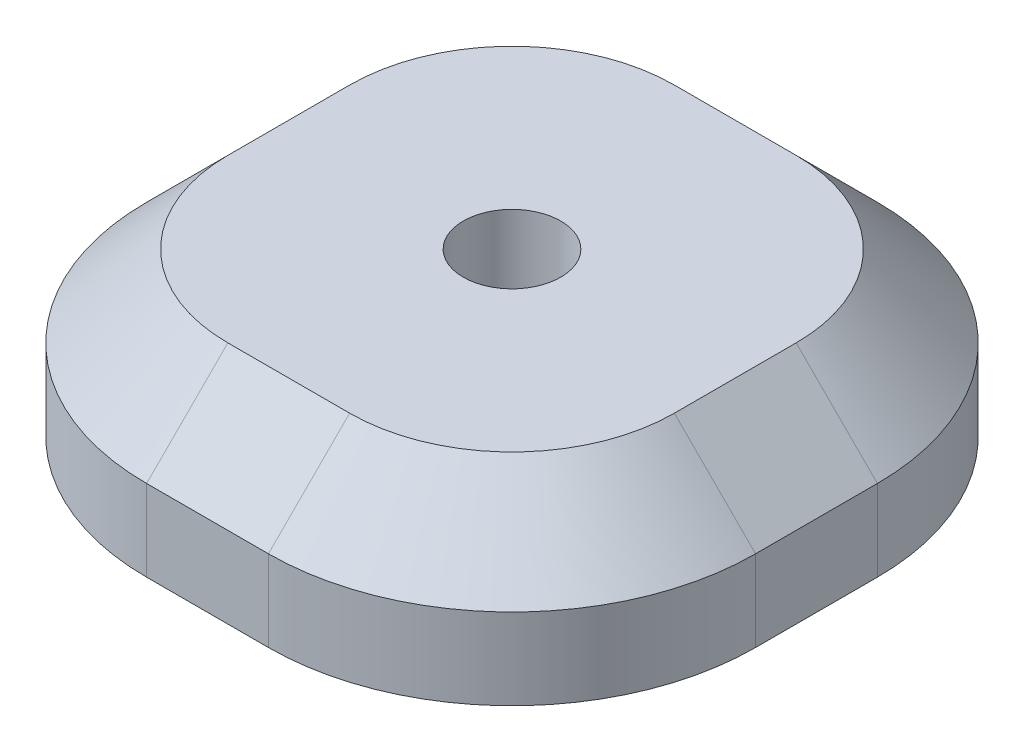
ISO-10303-21;
HEADER;
FILE_DESCRIPTION(('STEP AP214'),'2;1');
FILE_NAME('part.step','',(''),(''),'','','');
FILE_SCHEMA(('AUTOMOTIVE_DESIGN { 1 0 10303 214 1 1 1 1 }'));
ENDSEC;
DATA;
#1=APPLICATION_CONTEXT('core data for automotive mechanical design processes');
#2=APPLICATION_PROTOCOL_DEFINITION('international standard','automotive_design',2000,#1);
#3=PRODUCT_CONTEXT('',#1,'mechanical');
#4=PRODUCT('Part','Part','',(#3));
#5=PRODUCT_RELATED_PRODUCT_CATEGORY('part','',(#4));
#6=PRODUCT_DEFINITION_FORMATION('','',#4);
#7=PRODUCT_DEFINITION_CONTEXT('part definition',#1,'design');
#8=PRODUCT_DEFINITION('design','',#6,#7);
#9=PRODUCT_DEFINITION_SHAPE('','',#8);
#10=(LENGTH_UNIT() NAMED_UNIT(*) SI_UNIT(.MILLI.,.METRE.));
#11=(NAMED_UNIT(*) PLANE_ANGLE_UNIT() SI_UNIT($,.RADIAN.));
#12=(NAMED_UNIT(*) SI_UNIT($,.STERADIAN.) SOLID_ANGLE_UNIT());
#13=UNCERTAINTY_MEASURE_WITH_UNIT(LENGTH_MEASURE(1.E-05),#10,'distance_accuracy_value','');
#14=(GEOMETRIC_REPRESENTATION_CONTEXT(3) GLOBAL_UNCERTAINTY_ASSIGNED_CONTEXT((#13)) GLOBAL_UNIT_ASSIGNED_CONTEXT((#10,
#11,#12)) REPRESENTATION_CONTEXT('',''));
#15=CARTESIAN_POINT('',(0.,0.,0.));
#16=DIRECTION('',(0.,0.,1.));
#17=DIRECTION('',(1.,0.,0.));
#18=AXIS2_PLACEMENT_3D('',#15,#16,#17);
#19=CARTESIAN_POINT('',(-37.5,20.,37.5));
#20=DIRECTION('',(1.,0.,0.));
#21=DIRECTION('',(0.,0.,-1.));
#22=AXIS2_PLACEMENT_3D('',#19,#20,#21);
#23=PLANE('',#22);
#24=DIRECTION('',(0.,-1.,0.));
#25=VECTOR('',#24,1.);
#26=CARTESIAN_POINT('',(-37.5,20.,7.5));
#27=LINE('',#26,#25);
#28=CARTESIAN_POINT('',(-37.5,0.,7.5));
#29=VERTEX_POINT('',#28);
#30=CARTESIAN_POINT('',(-37.5,9.99999999999996,7.5));
#31=VERTEX_POINT('',#30);
#32=EDGE_CURVE('E212',#29,#31,#27,.F.);
#33=ORIENTED_EDGE('',*,*,#32,.T.);
#34=DIRECTION('',(0.,0.,-1.));
#35=VECTOR('',#34,1.);
#36=CARTESIAN_POINT('',(-37.5,9.99999999999996,37.5));
#37=LINE('',#36,#35);
#38=CARTESIAN_POINT('',(-37.5,9.99999999999996,-7.5));
#39=VERTEX_POINT('',#38);
#40=EDGE_CURVE('E239',#31,#39,#37,.T.);
#41=ORIENTED_EDGE('',*,*,#40,.T.);
#42=DIRECTION('',(0.,-1.,0.));
#43=VECTOR('',#42,1.);
#44=CARTESIAN_POINT('',(-37.5,20.,-7.5));
#45=LINE('',#44,#43);
#46=CARTESIAN_POINT('',(-37.5,0.,-7.5));
#47=VERTEX_POINT('',#46);
#48=EDGE_CURVE('E210',#39,#47,#45,.T.);
#49=ORIENTED_EDGE('',*,*,#48,.T.);
#50=DIRECTION('',(0.,0.,1.));
#51=VECTOR('',#50,1.);
#52=CARTESIAN_POINT('',(-37.5,0.,37.5));
#53=LINE('',#52,#51);
#54=EDGE_CURVE('E177',#47,#29,#53,.T.);
#55=ORIENTED_EDGE('',*,*,#54,.T.);
#56=EDGE_LOOP('',(#33,#41,#49,#55));
#57=FACE_BOUND('',#56,.T.);
#58=ADVANCED_FACE('F33',(#57),#23,.F.);
#59=CARTESIAN_POINT('',(37.5,20.,37.5));
#60=DIRECTION('',(0.,0.,-1.));
#61=DIRECTION('',(-1.,0.,0.));
#62=AXIS2_PLACEMENT_3D('',#59,#60,#61);
#63=PLANE('',#62);
#64=DIRECTION('',(0.,-1.,0.));
#65=VECTOR('',#64,1.);
#66=CARTESIAN_POINT('',(7.5,20.,37.5));
#67=LINE('',#66,#65);
#68=CARTESIAN_POINT('',(7.5,0.,37.5));
#69=VERTEX_POINT('',#68);
#70=CARTESIAN_POINT('',(7.5,9.99999999999996,37.5));
#71=VERTEX_POINT('',#70);
#72=EDGE_CURVE('E205',#69,#71,#67,.F.);
#73=ORIENTED_EDGE('',*,*,#72,.T.);
#74=DIRECTION('',(-1.,0.,0.));
#75=VECTOR('',#74,1.);
#76=CARTESIAN_POINT('',(37.5,9.99999999999996,37.5));
#77=LINE('',#76,#75);
#78=CARTESIAN_POINT('',(-7.5,9.99999999999996,37.5));
#79=VERTEX_POINT('',#78);
#80=EDGE_CURVE('E235',#71,#79,#77,.T.);
#81=ORIENTED_EDGE('',*,*,#80,.T.);
#82=DIRECTION('',(0.,-1.,0.));
#83=VECTOR('',#82,1.);
#84=CARTESIAN_POINT('',(-7.5,20.,37.5));
#85=LINE('',#84,#83);
#86=CARTESIAN_POINT('',(-7.5,0.,37.5));
#87=VERTEX_POINT('',#86);
#88=EDGE_CURVE('E208',#79,#87,#85,.T.);
#89=ORIENTED_EDGE('',*,*,#88,.T.);
#90=DIRECTION('',(1.,0.,0.));
#91=VECTOR('',#90,1.);
#92=CARTESIAN_POINT('',(37.5,0.,37.5));
#93=LINE('',#92,#91);
#94=EDGE_CURVE('E180',#87,#69,#93,.T.);
#95=ORIENTED_EDGE('',*,*,#94,.T.);
#96=EDGE_LOOP('',(#73,#81,#89,#95));
#97=FACE_BOUND('',#96,.T.);
#98=ADVANCED_FACE('F340',(#97),#63,.F.);
#99=CARTESIAN_POINT('',(37.5,20.,-37.5));
#100=DIRECTION('',(-1.,0.,0.));
#101=DIRECTION('',(0.,0.,1.));
#102=AXIS2_PLACEMENT_3D('',#99,#100,#101);
#103=PLANE('',#102);
#104=DIRECTION('',(0.,-1.,0.));
#105=VECTOR('',#104,1.);
#106=CARTESIAN_POINT('',(37.5,20.,-7.5));
#107=LINE('',#106,#105);
#108=CARTESIAN_POINT('',(37.5,0.,-7.5));
#109=VERTEX_POINT('',#108);
#110=CARTESIAN_POINT('',(37.5,9.99999999999996,-7.5));
#111=VERTEX_POINT('',#110);
#112=EDGE_CURVE('E203',#109,#111,#107,.F.);
#113=ORIENTED_EDGE('',*,*,#112,.T.);
#114=DIRECTION('',(0.,0.,1.));
#115=VECTOR('',#114,1.);
#116=CARTESIAN_POINT('',(37.5,9.99999999999996,-37.5));
#117=LINE('',#116,#115);
#118=CARTESIAN_POINT('',(37.5,9.99999999999996,7.5));
#119=VERTEX_POINT('',#118);
#120=EDGE_CURVE('E11',#111,#119,#117,.T.);
#121=ORIENTED_EDGE('',*,*,#120,.T.);
#122=DIRECTION('',(0.,-1.,0.));
#123=VECTOR('',#122,1.);
#124=CARTESIAN_POINT('',(37.5,20.,7.5));
#125=LINE('',#124,#123);
#126=CARTESIAN_POINT('',(37.5,0.,7.5));
#127=VERTEX_POINT('',#126);
#128=EDGE_CURVE('E201',#119,#127,#125,.T.);
#129=ORIENTED_EDGE('',*,*,#128,.T.);
#130=DIRECTION('',(0.,0.,-1.));
#131=VECTOR('',#130,1.);
#132=CARTESIAN_POINT('',(37.5,0.,-37.5));
#133=LINE('',#132,#131);
#134=EDGE_CURVE('E183',#127,#109,#133,.T.);
#135=ORIENTED_EDGE('',*,*,#134,.T.);
#136=EDGE_LOOP('',(#113,#121,#129,#135));
#137=FACE_BOUND('',#136,.T.);
#138=ADVANCED_FACE('F319',(#137),#103,.F.);
#139=CARTESIAN_POINT('',(-37.5,20.,-37.5));
#140=DIRECTION('',(0.,0.,1.));
#141=DIRECTION('',(1.,0.,0.));
#142=AXIS2_PLACEMENT_3D('',#139,#140,#141);
#143=PLANE('',#142);
#144=DIRECTION('',(0.,-1.,0.));
#145=VECTOR('',#144,1.);
#146=CARTESIAN_POINT('',(-7.5,20.,-37.5));
#147=LINE('',#146,#145);
#148=CARTESIAN_POINT('',(-7.5,0.,-37.5));
#149=VERTEX_POINT('',#148);
#150=CARTESIAN_POINT('',(-7.5,9.99999999999996,-37.5));
#151=VERTEX_POINT('',#150);
#152=EDGE_CURVE('E189',#149,#151,#147,.F.);
#153=ORIENTED_EDGE('',*,*,#152,.T.);
#154=DIRECTION('',(1.,0.,0.));
#155=VECTOR('',#154,1.);
#156=CARTESIAN_POINT('',(-37.5,9.99999999999996,-37.5));
#157=LINE('',#156,#155);
#158=CARTESIAN_POINT('',(7.5,9.99999999999996,-37.5));
#159=VERTEX_POINT('',#158);
#160=EDGE_CURVE('E57',#151,#159,#157,.T.);
#161=ORIENTED_EDGE('',*,*,#160,.T.);
#162=DIRECTION('',(0.,-1.,0.));
#163=VECTOR('',#162,1.);
#164=CARTESIAN_POINT('',(7.5,20.,-37.5));
#165=LINE('',#164,#163);
#166=CARTESIAN_POINT('',(7.5,0.,-37.5));
#167=VERTEX_POINT('',#166);
#168=EDGE_CURVE('E191',#159,#167,#165,.T.);
#169=ORIENTED_EDGE('',*,*,#168,.T.);
#170=DIRECTION('',(-1.,0.,0.));
#171=VECTOR('',#170,1.);
#172=CARTESIAN_POINT('',(-37.5,0.,-37.5));
#173=LINE('',#172,#171);
#174=EDGE_CURVE('E186',#167,#149,#173,.T.);
#175=ORIENTED_EDGE('',*,*,#174,.T.);
#176=EDGE_LOOP('',(#153,#161,#169,#175));
#177=FACE_BOUND('',#176,.T.);
#178=ADVANCED_FACE('F279',(#177),#143,.F.);
#179=CARTESIAN_POINT('',(0.,20.,0.));
#180=DIRECTION('',(0.,-1.,0.));
#181=DIRECTION('',(0.,0.,-1.));
#182=AXIS2_PLACEMENT_3D('',#179,#180,#181);
#183=PLANE('',#182);
#184=CARTESIAN_POINT('',(0.,20.,0.));
#185=DIRECTION('',(0.,1.,0.));
#186=DIRECTION('',(0.,0.,1.));
#187=AXIS2_PLACEMENT_3D('',#184,#185,#186);
#188=CIRCLE('',#187,6.);
#189=CARTESIAN_POINT('',(0.,20.,6.));
#190=VERTEX_POINT('',#189);
#191=EDGE_CURVE('E148',#190,#190,#188,.T.);
#192=ORIENTED_EDGE('',*,*,#191,.F.);
#193=EDGE_LOOP('',(#192));
#194=FACE_BOUND('',#193,.T.);
#195=DIRECTION('',(1.,0.,0.));
#196=VECTOR('',#195,1.);
#197=CARTESIAN_POINT('',(0.,20.,27.5));
#198=LINE('',#197,#196);
#199=CARTESIAN_POINT('',(-7.5,20.,27.5));
#200=VERTEX_POINT('',#199);
#201=CARTESIAN_POINT('',(7.5,20.,27.5));
#202=VERTEX_POINT('',#201);
#203=EDGE_CURVE('E227',#200,#202,#198,.T.);
#204=ORIENTED_EDGE('',*,*,#203,.T.);
#205=CARTESIAN_POINT('',(7.5,20.,7.5));
#206=DIRECTION('',(0.,-1.,0.));
#207=DIRECTION('',(0.,0.,-1.));
#208=AXIS2_PLACEMENT_3D('',#205,#206,#207);
#209=CIRCLE('',#208,20.);
#210=CARTESIAN_POINT('',(27.5,20.,7.5));
#211=VERTEX_POINT('',#210);
#212=EDGE_CURVE('E229',#202,#211,#209,.F.);
#213=ORIENTED_EDGE('',*,*,#212,.T.);
#214=DIRECTION('',(0.,0.,-1.));
#215=VECTOR('',#214,1.);
#216=CARTESIAN_POINT('',(27.5,20.,0.));
#217=LINE('',#216,#215);
#218=CARTESIAN_POINT('',(27.5,20.,-7.5));
#219=VERTEX_POINT('',#218);
#220=EDGE_CURVE('E215',#211,#219,#217,.T.);
#221=ORIENTED_EDGE('',*,*,#220,.T.);
#222=CARTESIAN_POINT('',(7.5,20.,-7.5));
#223=DIRECTION('',(0.,-1.,0.));
#224=DIRECTION('',(0.,0.,-1.));
#225=AXIS2_PLACEMENT_3D('',#222,#223,#224);
#226=CIRCLE('',#225,20.);
#227=CARTESIAN_POINT('',(7.5,20.,-27.5));
#228=VERTEX_POINT('',#227);
#229=EDGE_CURVE('E217',#219,#228,#226,.F.);
#230=ORIENTED_EDGE('',*,*,#229,.T.);
#231=DIRECTION('',(-1.,0.,0.));
#232=VECTOR('',#231,1.);
#233=CARTESIAN_POINT('',(0.,20.,-27.5));
#234=LINE('',#233,#232);
#235=CARTESIAN_POINT('',(-7.5,20.,-27.5));
#236=VERTEX_POINT('',#235);
#237=EDGE_CURVE('E219',#228,#236,#234,.T.);
#238=ORIENTED_EDGE('',*,*,#237,.T.);
#239=CARTESIAN_POINT('',(-7.5,20.,-7.5));
#240=DIRECTION('',(0.,-1.,0.));
#241=DIRECTION('',(0.,0.,-1.));
#242=AXIS2_PLACEMENT_3D('',#239,#240,#241);
#243=CIRCLE('',#242,20.);
#244=CARTESIAN_POINT('',(-27.5,20.,-7.5));
#245=VERTEX_POINT('',#244);
#246=EDGE_CURVE('E221',#236,#245,#243,.F.);
#247=ORIENTED_EDGE('',*,*,#246,.T.);
#248=DIRECTION('',(0.,0.,1.));
#249=VECTOR('',#248,1.);
#250=CARTESIAN_POINT('',(-27.5,20.,0.));
#251=LINE('',#250,#249);
#252=CARTESIAN_POINT('',(-27.5,20.,7.5));
#253=VERTEX_POINT('',#252);
#254=EDGE_CURVE('E223',#245,#253,#251,.T.);
#255=ORIENTED_EDGE('',*,*,#254,.T.);
#256=CARTESIAN_POINT('',(-7.5,20.,7.5));
#257=DIRECTION('',(0.,-1.,0.));
#258=DIRECTION('',(0.,0.,-1.));
#259=AXIS2_PLACEMENT_3D('',#256,#257,#258);
#260=CIRCLE('',#259,20.);
#261=EDGE_CURVE('E225',#253,#200,#260,.F.);
#262=ORIENTED_EDGE('',*,*,#261,.T.);
#263=EDGE_LOOP('',(#204,#213,#221,#230,#238,#247,#255,#262));
#264=FACE_BOUND('',#263,.T.);
#265=ADVANCED_FACE('F305',(#194,#264),#183,.F.);
#266=CARTESIAN_POINT('',(0.,0.,0.));
#267=DIRECTION('',(0.,-1.,0.));
#268=DIRECTION('',(0.,0.,-1.));
#269=AXIS2_PLACEMENT_3D('',#266,#267,#268);
#270=PLANE('',#269);
#271=CARTESIAN_POINT('',(-12.5,0.,12.5));
#272=DIRECTION('',(0.,-1.,0.));
#273=DIRECTION('',(0.,0.,-1.));
#274=AXIS2_PLACEMENT_3D('',#271,#272,#273);
#275=CIRCLE('',#274,6.);
#276=CARTESIAN_POINT('',(-12.5,0.,6.5));
#277=VERTEX_POINT('',#276);
#278=EDGE_CURVE('E147',#277,#277,#275,.T.);
#279=ORIENTED_EDGE('',*,*,#278,.F.);
#280=EDGE_LOOP('',(#279));
#281=FACE_BOUND('',#280,.T.);
#282=CARTESIAN_POINT('',(12.5,0.,12.5));
#283=DIRECTION('',(0.,-1.,0.));
#284=DIRECTION('',(0.,0.,-1.));
#285=AXIS2_PLACEMENT_3D('',#282,#283,#284);
#286=CIRCLE('',#285,6.);
#287=CARTESIAN_POINT('',(12.5,0.,6.5));
#288=VERTEX_POINT('',#287);
#289=EDGE_CURVE('E158',#288,#288,#286,.T.);
#290=ORIENTED_EDGE('',*,*,#289,.F.);
#291=EDGE_LOOP('',(#290));
#292=FACE_BOUND('',#291,.T.);
#293=CARTESIAN_POINT('',(12.5,0.,-12.5));
#294=DIRECTION('',(0.,-1.,0.));
#295=DIRECTION('',(0.,0.,-1.));
#296=AXIS2_PLACEMENT_3D('',#293,#294,#295);
#297=CIRCLE('',#296,6.);
#298=CARTESIAN_POINT('',(12.5,0.,-18.5));
#299=VERTEX_POINT('',#298);
#300=EDGE_CURVE('E164',#299,#299,#297,.T.);
#301=ORIENTED_EDGE('',*,*,#300,.F.);
#302=EDGE_LOOP('',(#301));
#303=FACE_BOUND('',#302,.T.);
#304=CARTESIAN_POINT('',(-12.5,0.,-12.5));
#305=DIRECTION('',(0.,-1.,0.));
#306=DIRECTION('',(0.,0.,-1.));
#307=AXIS2_PLACEMENT_3D('',#304,#305,#306);
#308=CIRCLE('',#307,6.);
#309=CARTESIAN_POINT('',(-12.5,0.,-18.5));
#310=VERTEX_POINT('',#309);
#311=EDGE_CURVE('E170',#310,#310,#308,.T.);
#312=ORIENTED_EDGE('',*,*,#311,.F.);
#313=EDGE_LOOP('',(#312));
#314=FACE_BOUND('',#313,.T.);
#315=ORIENTED_EDGE('',*,*,#174,.F.);
#316=CARTESIAN_POINT('',(7.5,0.,-7.5));
#317=DIRECTION('',(0.,-1.,0.));
#318=DIRECTION('',(0.,0.,-1.));
#319=AXIS2_PLACEMENT_3D('',#316,#317,#318);
#320=CIRCLE('',#319,30.);
#321=EDGE_CURVE('E199',#167,#109,#320,.T.);
#322=ORIENTED_EDGE('',*,*,#321,.T.);
#323=ORIENTED_EDGE('',*,*,#134,.F.);
#324=CARTESIAN_POINT('',(7.5,0.,7.5));
#325=DIRECTION('',(0.,-1.,0.));
#326=DIRECTION('',(0.,0.,-1.));
#327=AXIS2_PLACEMENT_3D('',#324,#325,#326);
#328=CIRCLE('',#327,30.);
#329=EDGE_CURVE('E193',#127,#69,#328,.T.);
#330=ORIENTED_EDGE('',*,*,#329,.T.);
#331=ORIENTED_EDGE('',*,*,#94,.F.);
#332=CARTESIAN_POINT('',(-7.5,0.,7.5));
#333=DIRECTION('',(0.,-1.,0.));
#334=DIRECTION('',(0.,0.,-1.));
#335=AXIS2_PLACEMENT_3D('',#332,#333,#334);
#336=CIRCLE('',#335,30.);
#337=EDGE_CURVE('E197',#87,#29,#336,.T.);
#338=ORIENTED_EDGE('',*,*,#337,.T.);
#339=ORIENTED_EDGE('',*,*,#54,.F.);
#340=CARTESIAN_POINT('',(-7.5,0.,-7.5));
#341=DIRECTION('',(0.,-1.,0.));
#342=DIRECTION('',(0.,0.,-1.));
#343=AXIS2_PLACEMENT_3D('',#340,#341,#342);
#344=CIRCLE('',#343,30.);
#345=EDGE_CURVE('E195',#47,#149,#344,.T.);
#346=ORIENTED_EDGE('',*,*,#345,.T.);
#347=EDGE_LOOP('',(#315,#322,#323,#330,#331,#338,#339,#346));
#348=FACE_BOUND('',#347,.T.);
#349=ADVANCED_FACE('F283',(#281,#292,#303,#314,#348),#270,.T.);
#350=CARTESIAN_POINT('',(7.5,20.,-7.5));
#351=DIRECTION('',(0.,-1.,0.));
#352=DIRECTION('',(0.,0.,-1.));
#353=AXIS2_PLACEMENT_3D('',#350,#351,#352);
#354=CYLINDRICAL_SURFACE('',#353,30.);
#355=ORIENTED_EDGE('',*,*,#168,.F.);
#356=CARTESIAN_POINT('',(7.5,9.99999999999996,-7.5));
#357=DIRECTION('',(0.,-1.,0.));
#358=DIRECTION('',(0.,0.,-1.));
#359=AXIS2_PLACEMENT_3D('',#356,#357,#358);
#360=CIRCLE('',#359,30.);
#361=EDGE_CURVE('E42',#159,#111,#360,.T.);
#362=ORIENTED_EDGE('',*,*,#361,.T.);
#363=ORIENTED_EDGE('',*,*,#112,.F.);
#364=ORIENTED_EDGE('',*,*,#321,.F.);
#365=EDGE_LOOP('',(#355,#362,#363,#364));
#366=FACE_BOUND('',#365,.T.);
#367=ADVANCED_FACE('F349',(#366),#354,.T.);
#368=CARTESIAN_POINT('',(-7.5,20.,7.5));
#369=DIRECTION('',(0.,-1.,0.));
#370=DIRECTION('',(0.,0.,-1.));
#371=AXIS2_PLACEMENT_3D('',#368,#369,#370);
#372=CYLINDRICAL_SURFACE('',#371,30.);
#373=ORIENTED_EDGE('',*,*,#88,.F.);
#374=CARTESIAN_POINT('',(-7.5,9.99999999999996,7.5));
#375=DIRECTION('',(0.,-1.,0.));
#376=DIRECTION('',(0.,0.,-1.));
#377=AXIS2_PLACEMENT_3D('',#374,#375,#376);
#378=CIRCLE('',#377,30.);
#379=EDGE_CURVE('E237',#79,#31,#378,.T.);
#380=ORIENTED_EDGE('',*,*,#379,.T.);
#381=ORIENTED_EDGE('',*,*,#32,.F.);
#382=ORIENTED_EDGE('',*,*,#337,.F.);
#383=EDGE_LOOP('',(#373,#380,#381,#382));
#384=FACE_BOUND('',#383,.T.);
#385=ADVANCED_FACE('F292',(#384),#372,.T.);
#386=CARTESIAN_POINT('',(-7.5,20.,-7.5));
#387=DIRECTION('',(0.,-1.,0.));
#388=DIRECTION('',(0.,0.,-1.));
#389=AXIS2_PLACEMENT_3D('',#386,#387,#388);
#390=CYLINDRICAL_SURFACE('',#389,30.);
#391=ORIENTED_EDGE('',*,*,#48,.F.);
#392=CARTESIAN_POINT('',(-7.5,9.99999999999996,-7.5));
#393=DIRECTION('',(0.,-1.,0.));
#394=DIRECTION('',(0.,0.,-1.));
#395=AXIS2_PLACEMENT_3D('',#392,#393,#394);
#396=CIRCLE('',#395,30.);
#397=EDGE_CURVE('E241',#39,#151,#396,.T.);
#398=ORIENTED_EDGE('',*,*,#397,.T.);
#399=ORIENTED_EDGE('',*,*,#152,.F.);
#400=ORIENTED_EDGE('',*,*,#345,.F.);
#401=EDGE_LOOP('',(#391,#398,#399,#400));
#402=FACE_BOUND('',#401,.T.);
#403=ADVANCED_FACE('F277',(#402),#390,.T.);
#404=CARTESIAN_POINT('',(7.5,20.,7.5));
#405=DIRECTION('',(0.,-1.,0.));
#406=DIRECTION('',(0.,0.,-1.));
#407=AXIS2_PLACEMENT_3D('',#404,#405,#406);
#408=CYLINDRICAL_SURFACE('',#407,30.);
#409=ORIENTED_EDGE('',*,*,#128,.F.);
#410=CARTESIAN_POINT('',(7.5,9.99999999999996,7.5));
#411=DIRECTION('',(0.,-1.,0.));
#412=DIRECTION('',(0.,0.,-1.));
#413=AXIS2_PLACEMENT_3D('',#410,#411,#412);
#414=CIRCLE('',#413,30.);
#415=EDGE_CURVE('E232',#119,#71,#414,.T.);
#416=ORIENTED_EDGE('',*,*,#415,.T.);
#417=ORIENTED_EDGE('',*,*,#72,.F.);
#418=ORIENTED_EDGE('',*,*,#329,.F.);
#419=EDGE_LOOP('',(#409,#416,#417,#418));
#420=FACE_BOUND('',#419,.T.);
#421=ADVANCED_FACE('F323',(#420),#408,.T.);
#422=CARTESIAN_POINT('',(-7.5,20.,-7.5));
#423=DIRECTION('',(0.,-1.,0.));
#424=DIRECTION('',(0.,0.,-1.));
#425=AXIS2_PLACEMENT_3D('',#422,#423,#424);
#426=CONICAL_SURFACE('',#425,20.,0.785398163397448);
#427=DIRECTION('',(0.,0.707106781186547,0.707106781186547));
#428=VECTOR('',#427,1.);
#429=CARTESIAN_POINT('',(-7.5,9.99999999999996,-37.5));
#430=LINE('',#429,#428);
#431=EDGE_CURVE('E259',#151,#236,#430,.T.);
#432=ORIENTED_EDGE('',*,*,#431,.F.);
#433=ORIENTED_EDGE('',*,*,#397,.F.);
#434=DIRECTION('',(-0.707106781186547,-0.707106781186547,0.));
#435=VECTOR('',#434,1.);
#436=CARTESIAN_POINT('',(-27.5,20.,-7.5));
#437=LINE('',#436,#435);
#438=EDGE_CURVE('E37',#245,#39,#437,.T.);
#439=ORIENTED_EDGE('',*,*,#438,.F.);
#440=ORIENTED_EDGE('',*,*,#246,.F.);
#441=EDGE_LOOP('',(#432,#433,#439,#440));
#442=FACE_BOUND('',#441,.T.);
#443=ADVANCED_FACE('F35',(#442),#426,.T.);
#444=CARTESIAN_POINT('',(-27.5,20.,0.));
#445=DIRECTION('',(0.707106781186547,-0.707106781186547,0.));
#446=DIRECTION('',(0.,0.,1.));
#447=AXIS2_PLACEMENT_3D('',#444,#445,#446);
#448=PLANE('',#447);
#449=ORIENTED_EDGE('',*,*,#438,.T.);
#450=ORIENTED_EDGE('',*,*,#40,.F.);
#451=DIRECTION('',(-0.707106781186547,-0.707106781186547,0.));
#452=VECTOR('',#451,1.);
#453=CARTESIAN_POINT('',(-27.5,20.,7.5));
#454=LINE('',#453,#452);
#455=EDGE_CURVE('E257',#253,#31,#454,.T.);
#456=ORIENTED_EDGE('',*,*,#455,.F.);
#457=ORIENTED_EDGE('',*,*,#254,.F.);
#458=EDGE_LOOP('',(#449,#450,#456,#457));
#459=FACE_BOUND('',#458,.T.);
#460=ADVANCED_FACE('F269',(#459),#448,.F.);
#461=CARTESIAN_POINT('',(0.,20.,-27.5));
#462=DIRECTION('',(0.,-0.707106781186547,0.707106781186547));
#463=DIRECTION('',(-1.,0.,0.));
#464=AXIS2_PLACEMENT_3D('',#461,#462,#463);
#465=PLANE('',#464);
#466=ORIENTED_EDGE('',*,*,#431,.T.);
#467=ORIENTED_EDGE('',*,*,#237,.F.);
#468=DIRECTION('',(0.,0.707106781186547,0.707106781186547));
#469=VECTOR('',#468,1.);
#470=CARTESIAN_POINT('',(7.5,9.99999999999996,-37.5));
#471=LINE('',#470,#469);
#472=EDGE_CURVE('E254',#159,#228,#471,.T.);
#473=ORIENTED_EDGE('',*,*,#472,.F.);
#474=ORIENTED_EDGE('',*,*,#160,.F.);
#475=EDGE_LOOP('',(#466,#467,#473,#474));
#476=FACE_BOUND('',#475,.T.);
#477=ADVANCED_FACE('F308',(#476),#465,.F.);
#478=CARTESIAN_POINT('',(-7.5,20.,7.5));
#479=DIRECTION('',(0.,-1.,0.));
#480=DIRECTION('',(0.,0.,-1.));
#481=AXIS2_PLACEMENT_3D('',#478,#479,#480);
#482=CONICAL_SURFACE('',#481,20.,0.785398163397448);
#483=ORIENTED_EDGE('',*,*,#455,.T.);
#484=ORIENTED_EDGE('',*,*,#379,.F.);
#485=DIRECTION('',(0.,-0.707106781186547,0.707106781186547));
#486=VECTOR('',#485,1.);
#487=CARTESIAN_POINT('',(-7.5,20.,27.5));
#488=LINE('',#487,#486);
#489=EDGE_CURVE('E251',#200,#79,#488,.T.);
#490=ORIENTED_EDGE('',*,*,#489,.F.);
#491=ORIENTED_EDGE('',*,*,#261,.F.);
#492=EDGE_LOOP('',(#483,#484,#490,#491));
#493=FACE_BOUND('',#492,.T.);
#494=ADVANCED_FACE('F296',(#493),#482,.T.);
#495=CARTESIAN_POINT('',(7.5,20.,-7.5));
#496=DIRECTION('',(0.,-1.,0.));
#497=DIRECTION('',(0.,0.,-1.));
#498=AXIS2_PLACEMENT_3D('',#495,#496,#497);
#499=CONICAL_SURFACE('',#498,20.,0.785398163397448);
#500=ORIENTED_EDGE('',*,*,#472,.T.);
#501=ORIENTED_EDGE('',*,*,#229,.F.);
#502=DIRECTION('',(-0.707106781186547,0.707106781186547,0.));
#503=VECTOR('',#502,1.);
#504=CARTESIAN_POINT('',(37.5,9.99999999999996,-7.5));
#505=LINE('',#504,#503);
#506=EDGE_CURVE('E248',#111,#219,#505,.T.);
#507=ORIENTED_EDGE('',*,*,#506,.F.);
#508=ORIENTED_EDGE('',*,*,#361,.F.);
#509=EDGE_LOOP('',(#500,#501,#507,#508));
#510=FACE_BOUND('',#509,.T.);
#511=ADVANCED_FACE('F310',(#510),#499,.T.);
#512=CARTESIAN_POINT('',(0.,20.,27.5));
#513=DIRECTION('',(0.,-0.707106781186547,-0.707106781186547));
#514=DIRECTION('',(1.,0.,0.));
#515=AXIS2_PLACEMENT_3D('',#512,#513,#514);
#516=PLANE('',#515);
#517=ORIENTED_EDGE('',*,*,#489,.T.);
#518=ORIENTED_EDGE('',*,*,#80,.F.);
#519=DIRECTION('',(0.,-0.707106781186547,0.707106781186547));
#520=VECTOR('',#519,1.);
#521=CARTESIAN_POINT('',(7.5,20.,27.5));
#522=LINE('',#521,#520);
#523=EDGE_CURVE('E246',#202,#71,#522,.T.);
#524=ORIENTED_EDGE('',*,*,#523,.F.);
#525=ORIENTED_EDGE('',*,*,#203,.F.);
#526=EDGE_LOOP('',(#517,#518,#524,#525));
#527=FACE_BOUND('',#526,.T.);
#528=ADVANCED_FACE('F301',(#527),#516,.F.);
#529=CARTESIAN_POINT('',(27.5,20.,0.));
#530=DIRECTION('',(-0.707106781186547,-0.707106781186547,0.));
#531=DIRECTION('',(0.,0.,-1.));
#532=AXIS2_PLACEMENT_3D('',#529,#530,#531);
#533=PLANE('',#532);
#534=ORIENTED_EDGE('',*,*,#506,.T.);
#535=ORIENTED_EDGE('',*,*,#220,.F.);
#536=DIRECTION('',(-0.707106781186547,0.707106781186547,0.));
#537=VECTOR('',#536,1.);
#538=CARTESIAN_POINT('',(37.5,9.99999999999996,7.5));
#539=LINE('',#538,#537);
#540=EDGE_CURVE('E176',#119,#211,#539,.T.);
#541=ORIENTED_EDGE('',*,*,#540,.F.);
#542=ORIENTED_EDGE('',*,*,#120,.F.);
#543=EDGE_LOOP('',(#534,#535,#541,#542));
#544=FACE_BOUND('',#543,.T.);
#545=ADVANCED_FACE('F316',(#544),#533,.F.);
#546=CARTESIAN_POINT('',(7.5,20.,7.5));
#547=DIRECTION('',(0.,-1.,0.));
#548=DIRECTION('',(0.,0.,-1.));
#549=AXIS2_PLACEMENT_3D('',#546,#547,#548);
#550=CONICAL_SURFACE('',#549,20.,0.785398163397448);
#551=ORIENTED_EDGE('',*,*,#523,.T.);
#552=ORIENTED_EDGE('',*,*,#415,.F.);
#553=ORIENTED_EDGE('',*,*,#540,.T.);
#554=ORIENTED_EDGE('',*,*,#212,.F.);
#555=EDGE_LOOP('',(#551,#552,#553,#554));
#556=FACE_BOUND('',#555,.T.);
#557=ADVANCED_FACE('F326',(#556),#550,.T.);
#558=CARTESIAN_POINT('',(-12.5,9.99999999999999,-12.5));
#559=DIRECTION('',(0.,-1.,0.));
#560=DIRECTION('',(0.,0.,-1.));
#561=AXIS2_PLACEMENT_3D('',#558,#559,#560);
#562=CONICAL_SURFACE('',#561,6.,1.02974425867665);
#563=CARTESIAN_POINT('',(-12.5,13.6051637141654,-12.5));
#564=VERTEX_POINT('',#563);
#565=VERTEX_LOOP('',#564);
#566=FACE_BOUND('',#565,.T.);
#567=CARTESIAN_POINT('',(-12.5,9.99999999999999,-12.5));
#568=DIRECTION('',(0.,-1.,0.));
#569=DIRECTION('',(0.,0.,-1.));
#570=AXIS2_PLACEMENT_3D('',#567,#568,#569);
#571=CIRCLE('',#570,6.);
#572=CARTESIAN_POINT('',(-12.5,9.99999999999999,-18.5));
#573=VERTEX_POINT('',#572);
#574=EDGE_CURVE('E173',#573,#573,#571,.T.);
#575=ORIENTED_EDGE('',*,*,#574,.T.);
#576=EDGE_LOOP('',(#575));
#577=FACE_BOUND('',#576,.T.);
#578=ADVANCED_FACE('F328',(#566,#577),#562,.F.);
#579=CARTESIAN_POINT('',(-12.5,0.,-12.5));
#580=DIRECTION('',(0.,-1.,0.));
#581=DIRECTION('',(0.,0.,-1.));
#582=AXIS2_PLACEMENT_3D('',#579,#580,#581);
#583=CYLINDRICAL_SURFACE('',#582,6.);
#584=ORIENTED_EDGE('',*,*,#574,.F.);
#585=EDGE_LOOP('',(#584));
#586=FACE_BOUND('',#585,.T.);
#587=ORIENTED_EDGE('',*,*,#311,.T.);
#588=EDGE_LOOP('',(#587));
#589=FACE_BOUND('',#588,.T.);
#590=ADVANCED_FACE('F334',(#586,#589),#583,.F.);
#591=CARTESIAN_POINT('',(12.5,9.99999999999999,-12.5));
#592=DIRECTION('',(0.,-1.,0.));
#593=DIRECTION('',(0.,0.,-1.));
#594=AXIS2_PLACEMENT_3D('',#591,#592,#593);
#595=CONICAL_SURFACE('',#594,6.,1.02974425867665);
#596=CARTESIAN_POINT('',(12.5,13.6051637141654,-12.5));
#597=VERTEX_POINT('',#596);
#598=VERTEX_LOOP('',#597);
#599=FACE_BOUND('',#598,.T.);
#600=CARTESIAN_POINT('',(12.5,9.99999999999999,-12.5));
#601=DIRECTION('',(0.,-1.,0.));
#602=DIRECTION('',(0.,0.,-1.));
#603=AXIS2_PLACEMENT_3D('',#600,#601,#602);
#604=CIRCLE('',#603,6.);
#605=CARTESIAN_POINT('',(12.5,9.99999999999999,-18.5));
#606=VERTEX_POINT('',#605);
#607=EDGE_CURVE('E167',#606,#606,#604,.T.);
#608=ORIENTED_EDGE('',*,*,#607,.T.);
#609=EDGE_LOOP('',(#608));
#610=FACE_BOUND('',#609,.T.);
#611=ADVANCED_FACE('F411',(#599,#610),#595,.F.);
#612=CARTESIAN_POINT('',(12.5,0.,-12.5));
#613=DIRECTION('',(0.,-1.,0.));
#614=DIRECTION('',(0.,0.,-1.));
#615=AXIS2_PLACEMENT_3D('',#612,#613,#614);
#616=CYLINDRICAL_SURFACE('',#615,6.);
#617=ORIENTED_EDGE('',*,*,#607,.F.);
#618=EDGE_LOOP('',(#617));
#619=FACE_BOUND('',#618,.T.);
#620=ORIENTED_EDGE('',*,*,#300,.T.);
#621=EDGE_LOOP('',(#620));
#622=FACE_BOUND('',#621,.T.);
#623=ADVANCED_FACE('F421',(#619,#622),#616,.F.);
#624=CARTESIAN_POINT('',(12.5,9.99999999999999,12.5));
#625=DIRECTION('',(0.,-1.,0.));
#626=DIRECTION('',(0.,0.,-1.));
#627=AXIS2_PLACEMENT_3D('',#624,#625,#626);
#628=CONICAL_SURFACE('',#627,6.,1.02974425867665);
#629=CARTESIAN_POINT('',(12.5,13.6051637141654,12.5));
#630=VERTEX_POINT('',#629);
#631=VERTEX_LOOP('',#630);
#632=FACE_BOUND('',#631,.T.);
#633=CARTESIAN_POINT('',(12.5,9.99999999999999,12.5));
#634=DIRECTION('',(0.,-1.,0.));
#635=DIRECTION('',(0.,0.,-1.));
#636=AXIS2_PLACEMENT_3D('',#633,#634,#635);
#637=CIRCLE('',#636,6.);
#638=CARTESIAN_POINT('',(12.5,9.99999999999999,6.5));
#639=VERTEX_POINT('',#638);
#640=EDGE_CURVE('E161',#639,#639,#637,.T.);
#641=ORIENTED_EDGE('',*,*,#640,.T.);
#642=EDGE_LOOP('',(#641));
#643=FACE_BOUND('',#642,.T.);
#644=ADVANCED_FACE('F431',(#632,#643),#628,.F.);
#645=CARTESIAN_POINT('',(12.5,0.,12.5));
#646=DIRECTION('',(0.,-1.,0.));
#647=DIRECTION('',(0.,0.,-1.));
#648=AXIS2_PLACEMENT_3D('',#645,#646,#647);
#649=CYLINDRICAL_SURFACE('',#648,6.);
#650=ORIENTED_EDGE('',*,*,#640,.F.);
#651=EDGE_LOOP('',(#650));
#652=FACE_BOUND('',#651,.T.);
#653=ORIENTED_EDGE('',*,*,#289,.T.);
#654=EDGE_LOOP('',(#653));
#655=FACE_BOUND('',#654,.T.);
#656=ADVANCED_FACE('F441',(#652,#655),#649,.F.);
#657=CARTESIAN_POINT('',(-12.5,9.99999999999999,12.5));
#658=DIRECTION('',(0.,-1.,0.));
#659=DIRECTION('',(0.,0.,-1.));
#660=AXIS2_PLACEMENT_3D('',#657,#658,#659);
#661=CONICAL_SURFACE('',#660,6.,1.02974425867665);
#662=CARTESIAN_POINT('',(-12.5,13.6051637141654,12.5));
#663=VERTEX_POINT('',#662);
#664=VERTEX_LOOP('',#663);
#665=FACE_BOUND('',#664,.T.);
#666=CARTESIAN_POINT('',(-12.5,9.99999999999999,12.5));
#667=DIRECTION('',(0.,-1.,0.));
#668=DIRECTION('',(0.,0.,-1.));
#669=AXIS2_PLACEMENT_3D('',#666,#667,#668);
#670=CIRCLE('',#669,6.);
#671=CARTESIAN_POINT('',(-12.5,9.99999999999999,6.5));
#672=VERTEX_POINT('',#671);
#673=EDGE_CURVE('E151',#672,#672,#670,.T.);
#674=ORIENTED_EDGE('',*,*,#673,.T.);
#675=EDGE_LOOP('',(#674));
#676=FACE_BOUND('',#675,.T.);
#677=ADVANCED_FACE('F451',(#665,#676),#661,.F.);
#678=CARTESIAN_POINT('',(-12.5,0.,12.5));
#679=DIRECTION('',(0.,-1.,0.));
#680=DIRECTION('',(0.,0.,-1.));
#681=AXIS2_PLACEMENT_3D('',#678,#679,#680);
#682=CYLINDRICAL_SURFACE('',#681,6.);
#683=ORIENTED_EDGE('',*,*,#673,.F.);
#684=EDGE_LOOP('',(#683));
#685=FACE_BOUND('',#684,.T.);
#686=ORIENTED_EDGE('',*,*,#278,.T.);
#687=EDGE_LOOP('',(#686));
#688=FACE_BOUND('',#687,.T.);
#689=ADVANCED_FACE('F141',(#685,#688),#682,.F.);
#690=CARTESIAN_POINT('',(0.,10.,0.));
#691=DIRECTION('',(0.,1.,0.));
#692=DIRECTION('',(0.,0.,1.));
#693=AXIS2_PLACEMENT_3D('',#690,#691,#692);
#694=CONICAL_SURFACE('',#693,6.,1.02974425867665);
#695=CARTESIAN_POINT('',(0.,6.39483628583465,0.));
#696=VERTEX_POINT('',#695);
#697=VERTEX_LOOP('',#696);
#698=FACE_BOUND('',#697,.T.);
#699=CARTESIAN_POINT('',(0.,10.,0.));
#700=DIRECTION('',(0.,1.,0.));
#701=DIRECTION('',(0.,0.,1.));
#702=AXIS2_PLACEMENT_3D('',#699,#700,#701);
#703=CIRCLE('',#702,6.);
#704=CARTESIAN_POINT('',(0.,10.,6.));
#705=VERTEX_POINT('',#704);
#706=EDGE_CURVE('E145',#705,#705,#703,.T.);
#707=ORIENTED_EDGE('',*,*,#706,.T.);
#708=EDGE_LOOP('',(#707));
#709=FACE_BOUND('',#708,.T.);
#710=ADVANCED_FACE('F137',(#698,#709),#694,.F.);
#711=CARTESIAN_POINT('',(0.,20.,0.));
#712=DIRECTION('',(0.,1.,0.));
#713=DIRECTION('',(0.,0.,1.));
#714=AXIS2_PLACEMENT_3D('',#711,#712,#713);
#715=CYLINDRICAL_SURFACE('',#714,6.);
#716=ORIENTED_EDGE('',*,*,#706,.F.);
#717=EDGE_LOOP('',(#716));
#718=FACE_BOUND('',#717,.T.);
#719=ORIENTED_EDGE('',*,*,#191,.T.);
#720=EDGE_LOOP('',(#719));
#721=FACE_BOUND('',#720,.T.);
#722=ADVANCED_FACE('F140',(#718,#721),#715,.F.);
#723=CLOSED_SHELL('',(#58,#98,#138,#178,#265,#349,#367,#385,#403,#421,#443,#460,#477,#494,#511,
#528,#545,#557,#578,#590,#611,#623,#644,#656,#677,#689,#710,#722));
#724=MANIFOLD_SOLID_BREP('B2',#723);
#725=ADVANCED_BREP_SHAPE_REPRESENTATION('',(#18,#724),#14);
#726=SHAPE_DEFINITION_REPRESENTATION(#9,#725);
ENDSEC;
END-ISO-10303-21;
